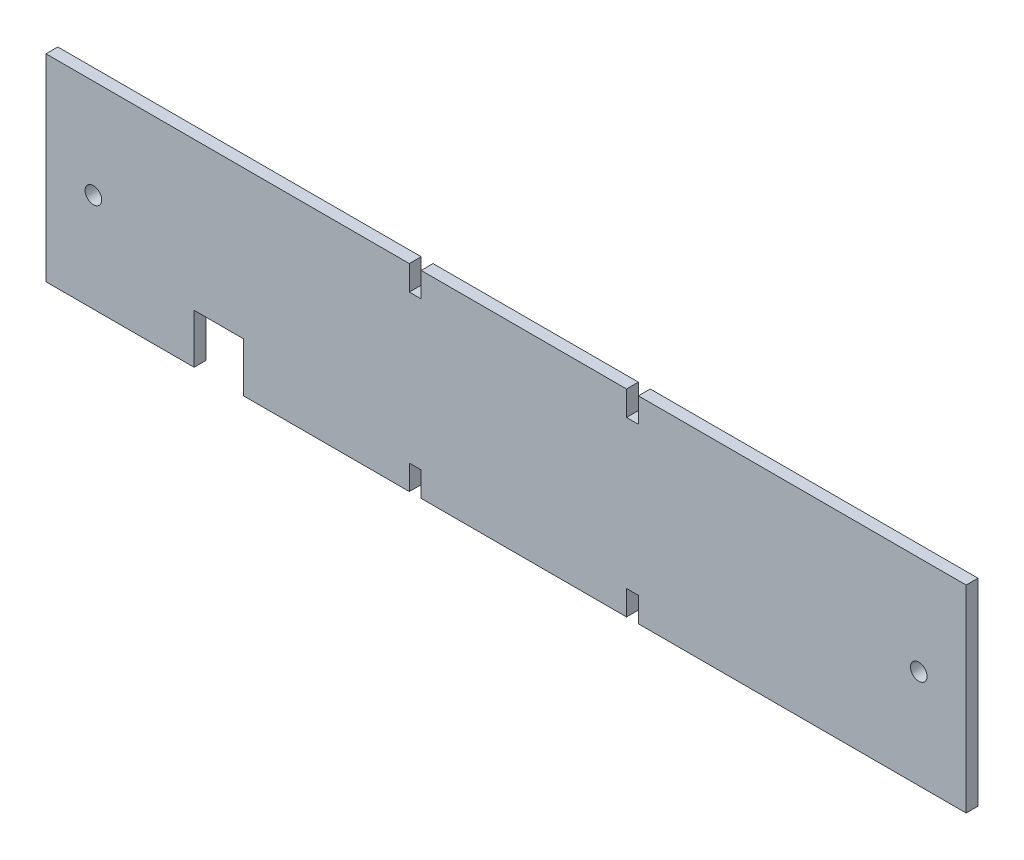
ISO-10303-21;
HEADER;
FILE_DESCRIPTION(('STEP AP214'),'2;1');
FILE_NAME('part.step','',(''),(''),'','','');
FILE_SCHEMA(('AUTOMOTIVE_DESIGN { 1 0 10303 214 1 1 1 1 }'));
ENDSEC;
DATA;
#1=APPLICATION_CONTEXT('core data for automotive mechanical design processes');
#2=APPLICATION_PROTOCOL_DEFINITION('international standard','automotive_design',2000,#1);
#3=PRODUCT_CONTEXT('',#1,'mechanical');
#4=PRODUCT('Part','Part','',(#3));
#5=PRODUCT_RELATED_PRODUCT_CATEGORY('part','',(#4));
#6=PRODUCT_DEFINITION_FORMATION('','',#4);
#7=PRODUCT_DEFINITION_CONTEXT('part definition',#1,'design');
#8=PRODUCT_DEFINITION('design','',#6,#7);
#9=PRODUCT_DEFINITION_SHAPE('','',#8);
#10=(LENGTH_UNIT() NAMED_UNIT(*) SI_UNIT(.MILLI.,.METRE.));
#11=(NAMED_UNIT(*) PLANE_ANGLE_UNIT() SI_UNIT($,.RADIAN.));
#12=(NAMED_UNIT(*) SI_UNIT($,.STERADIAN.) SOLID_ANGLE_UNIT());
#13=UNCERTAINTY_MEASURE_WITH_UNIT(LENGTH_MEASURE(1.E-05),#10,'distance_accuracy_value','');
#14=(GEOMETRIC_REPRESENTATION_CONTEXT(3) GLOBAL_UNCERTAINTY_ASSIGNED_CONTEXT((#13)) GLOBAL_UNIT_ASSIGNED_CONTEXT((#10,
#11,#12)) REPRESENTATION_CONTEXT('',''));
#15=CARTESIAN_POINT('',(0.,0.,0.));
#16=DIRECTION('',(0.,0.,1.));
#17=DIRECTION('',(1.,0.,0.));
#18=AXIS2_PLACEMENT_3D('',#15,#16,#17);
#19=CARTESIAN_POINT('',(0.,0.,6.));
#20=DIRECTION('',(0.,1.,0.));
#21=DIRECTION('',(0.,0.,1.));
#22=AXIS2_PLACEMENT_3D('',#19,#20,#21);
#23=PLANE('',#22);
#24=DIRECTION('',(1.,0.,0.));
#25=VECTOR('',#24,1.);
#26=CARTESIAN_POINT('',(0.,0.,6.));
#27=LINE('',#26,#25);
#28=CARTESIAN_POINT('',(300.,0.,6.));
#29=VERTEX_POINT('',#28);
#30=CARTESIAN_POINT('',(466.,0.,6.));
#31=VERTEX_POINT('',#30);
#32=EDGE_CURVE('E223',#29,#31,#27,.T.);
#33=ORIENTED_EDGE('',*,*,#32,.F.);
#34=DIRECTION('',(0.,0.,-1.));
#35=VECTOR('',#34,1.);
#36=CARTESIAN_POINT('',(300.,0.,6.));
#37=LINE('',#36,#35);
#38=CARTESIAN_POINT('',(300.,0.,0.));
#39=VERTEX_POINT('',#38);
#40=EDGE_CURVE('E290',#29,#39,#37,.T.);
#41=ORIENTED_EDGE('',*,*,#40,.T.);
#42=DIRECTION('',(1.,0.,0.));
#43=VECTOR('',#42,1.);
#44=CARTESIAN_POINT('',(0.,0.,0.));
#45=LINE('',#44,#43);
#46=CARTESIAN_POINT('',(466.,0.,0.));
#47=VERTEX_POINT('',#46);
#48=EDGE_CURVE('E243',#39,#47,#45,.T.);
#49=ORIENTED_EDGE('',*,*,#48,.T.);
#50=DIRECTION('',(0.,0.,-1.));
#51=VECTOR('',#50,1.);
#52=CARTESIAN_POINT('',(466.,0.,6.));
#53=LINE('',#52,#51);
#54=EDGE_CURVE('E41',#31,#47,#53,.T.);
#55=ORIENTED_EDGE('',*,*,#54,.F.);
#56=EDGE_LOOP('',(#33,#41,#49,#55));
#57=FACE_BOUND('',#56,.T.);
#58=ADVANCED_FACE('F33',(#57),#23,.F.);
#59=CARTESIAN_POINT('',(190.,0.,0.));
#60=VERTEX_POINT('',#59);
#61=CARTESIAN_POINT('',(294.,0.,0.));
#62=VERTEX_POINT('',#61);
#63=EDGE_CURVE('E637',#60,#62,#45,.T.);
#64=ORIENTED_EDGE('',*,*,#63,.T.);
#65=DIRECTION('',(0.,0.,-1.));
#66=VECTOR('',#65,1.);
#67=CARTESIAN_POINT('',(294.,0.,6.));
#68=LINE('',#67,#66);
#69=CARTESIAN_POINT('',(294.,0.,6.));
#70=VERTEX_POINT('',#69);
#71=EDGE_CURVE('E56',#70,#62,#68,.T.);
#72=ORIENTED_EDGE('',*,*,#71,.F.);
#73=CARTESIAN_POINT('',(190.,0.,6.));
#74=VERTEX_POINT('',#73);
#75=EDGE_CURVE('E215',#74,#70,#27,.T.);
#76=ORIENTED_EDGE('',*,*,#75,.F.);
#77=DIRECTION('',(0.,0.,-1.));
#78=VECTOR('',#77,1.);
#79=CARTESIAN_POINT('',(190.,0.,6.));
#80=LINE('',#79,#78);
#81=EDGE_CURVE('E195',#74,#60,#80,.T.);
#82=ORIENTED_EDGE('',*,*,#81,.T.);
#83=EDGE_LOOP('',(#64,#72,#76,#82));
#84=FACE_BOUND('',#83,.T.);
#85=ADVANCED_FACE('F221',(#84),#23,.F.);
#86=CARTESIAN_POINT('',(0.,100.,6.));
#87=DIRECTION('',(0.,-1.,0.));
#88=DIRECTION('',(0.,0.,-1.));
#89=AXIS2_PLACEMENT_3D('',#86,#87,#88);
#90=PLANE('',#89);
#91=DIRECTION('',(-1.,0.,0.));
#92=VECTOR('',#91,1.);
#93=CARTESIAN_POINT('',(0.,100.,6.));
#94=LINE('',#93,#92);
#95=CARTESIAN_POINT('',(184.,100.,6.));
#96=VERTEX_POINT('',#95);
#97=CARTESIAN_POINT('',(0.,100.,6.));
#98=VERTEX_POINT('',#97);
#99=EDGE_CURVE('E234',#96,#98,#94,.T.);
#100=ORIENTED_EDGE('',*,*,#99,.F.);
#101=DIRECTION('',(0.,0.,-1.));
#102=VECTOR('',#101,1.);
#103=CARTESIAN_POINT('',(184.,100.,6.));
#104=LINE('',#103,#102);
#105=CARTESIAN_POINT('',(184.,100.,0.));
#106=VERTEX_POINT('',#105);
#107=EDGE_CURVE('E419',#96,#106,#104,.T.);
#108=ORIENTED_EDGE('',*,*,#107,.T.);
#109=DIRECTION('',(-1.,0.,0.));
#110=VECTOR('',#109,1.);
#111=CARTESIAN_POINT('',(0.,100.,0.));
#112=LINE('',#111,#110);
#113=CARTESIAN_POINT('',(0.,100.,0.));
#114=VERTEX_POINT('',#113);
#115=EDGE_CURVE('E251',#106,#114,#112,.T.);
#116=ORIENTED_EDGE('',*,*,#115,.T.);
#117=DIRECTION('',(0.,0.,-1.));
#118=VECTOR('',#117,1.);
#119=CARTESIAN_POINT('',(0.,100.,6.));
#120=LINE('',#119,#118);
#121=EDGE_CURVE('E238',#98,#114,#120,.T.);
#122=ORIENTED_EDGE('',*,*,#121,.F.);
#123=EDGE_LOOP('',(#100,#108,#116,#122));
#124=FACE_BOUND('',#123,.T.);
#125=ADVANCED_FACE('F376',(#124),#90,.F.);
#126=CARTESIAN_POINT('',(466.,100.,0.));
#127=VERTEX_POINT('',#126);
#128=CARTESIAN_POINT('',(300.,100.,0.));
#129=VERTEX_POINT('',#128);
#130=EDGE_CURVE('E252',#127,#129,#112,.T.);
#131=ORIENTED_EDGE('',*,*,#130,.T.);
#132=DIRECTION('',(0.,0.,-1.));
#133=VECTOR('',#132,1.);
#134=CARTESIAN_POINT('',(300.,100.,6.));
#135=LINE('',#134,#133);
#136=CARTESIAN_POINT('',(300.,100.,6.));
#137=VERTEX_POINT('',#136);
#138=EDGE_CURVE('E281',#137,#129,#135,.T.);
#139=ORIENTED_EDGE('',*,*,#138,.F.);
#140=CARTESIAN_POINT('',(466.,100.,6.));
#141=VERTEX_POINT('',#140);
#142=EDGE_CURVE('E235',#141,#137,#94,.T.);
#143=ORIENTED_EDGE('',*,*,#142,.F.);
#144=DIRECTION('',(0.,0.,-1.));
#145=VECTOR('',#144,1.);
#146=CARTESIAN_POINT('',(466.,100.,6.));
#147=LINE('',#146,#145);
#148=EDGE_CURVE('E258',#141,#127,#147,.T.);
#149=ORIENTED_EDGE('',*,*,#148,.T.);
#150=EDGE_LOOP('',(#131,#139,#143,#149));
#151=FACE_BOUND('',#150,.T.);
#152=ADVANCED_FACE('F279',(#151),#90,.F.);
#153=CARTESIAN_POINT('',(0.,0.,0.));
#154=VERTEX_POINT('',#153);
#155=CARTESIAN_POINT('',(75.,0.,0.));
#156=VERTEX_POINT('',#155);
#157=EDGE_CURVE('E245',#154,#156,#45,.T.);
#158=ORIENTED_EDGE('',*,*,#157,.T.);
#159=DIRECTION('',(0.,0.,-1.));
#160=VECTOR('',#159,1.);
#161=CARTESIAN_POINT('',(75.,0.,12.));
#162=LINE('',#161,#160);
#163=CARTESIAN_POINT('',(75.,0.,6.));
#164=VERTEX_POINT('',#163);
#165=EDGE_CURVE('E329',#164,#156,#162,.T.);
#166=ORIENTED_EDGE('',*,*,#165,.F.);
#167=CARTESIAN_POINT('',(0.,0.,6.));
#168=VERTEX_POINT('',#167);
#169=EDGE_CURVE('E226',#168,#164,#27,.T.);
#170=ORIENTED_EDGE('',*,*,#169,.F.);
#171=DIRECTION('',(0.,0.,-1.));
#172=VECTOR('',#171,1.);
#173=CARTESIAN_POINT('',(0.,0.,6.));
#174=LINE('',#173,#172);
#175=EDGE_CURVE('E11',#168,#154,#174,.T.);
#176=ORIENTED_EDGE('',*,*,#175,.T.);
#177=EDGE_LOOP('',(#158,#166,#170,#176));
#178=FACE_BOUND('',#177,.T.);
#179=ADVANCED_FACE('F383',(#178),#23,.F.);
#180=CARTESIAN_POINT('',(0.,0.,6.));
#181=DIRECTION('',(1.,0.,0.));
#182=DIRECTION('',(0.,0.,-1.));
#183=AXIS2_PLACEMENT_3D('',#180,#181,#182);
#184=PLANE('',#183);
#185=DIRECTION('',(0.,-1.,0.));
#186=VECTOR('',#185,1.);
#187=CARTESIAN_POINT('',(0.,0.,0.));
#188=LINE('',#187,#186);
#189=EDGE_CURVE('E240',#114,#154,#188,.T.);
#190=ORIENTED_EDGE('',*,*,#189,.T.);
#191=ORIENTED_EDGE('',*,*,#175,.F.);
#192=DIRECTION('',(0.,-1.,0.));
#193=VECTOR('',#192,1.);
#194=CARTESIAN_POINT('',(0.,0.,6.));
#195=LINE('',#194,#193);
#196=EDGE_CURVE('E227',#98,#168,#195,.T.);
#197=ORIENTED_EDGE('',*,*,#196,.F.);
#198=ORIENTED_EDGE('',*,*,#121,.T.);
#199=EDGE_LOOP('',(#190,#191,#197,#198));
#200=FACE_BOUND('',#199,.T.);
#201=ADVANCED_FACE('F35',(#200),#184,.F.);
#202=CARTESIAN_POINT('',(100.,0.,0.));
#203=VERTEX_POINT('',#202);
#204=CARTESIAN_POINT('',(184.,0.,0.));
#205=VERTEX_POINT('',#204);
#206=EDGE_CURVE('E249',#203,#205,#45,.T.);
#207=ORIENTED_EDGE('',*,*,#206,.T.);
#208=DIRECTION('',(0.,0.,-1.));
#209=VECTOR('',#208,1.);
#210=CARTESIAN_POINT('',(184.,0.,6.));
#211=LINE('',#210,#209);
#212=CARTESIAN_POINT('',(184.,0.,6.));
#213=VERTEX_POINT('',#212);
#214=EDGE_CURVE('E206',#213,#205,#211,.T.);
#215=ORIENTED_EDGE('',*,*,#214,.F.);
#216=CARTESIAN_POINT('',(100.,0.,6.));
#217=VERTEX_POINT('',#216);
#218=EDGE_CURVE('E222',#217,#213,#27,.T.);
#219=ORIENTED_EDGE('',*,*,#218,.F.);
#220=DIRECTION('',(0.,0.,-1.));
#221=VECTOR('',#220,1.);
#222=CARTESIAN_POINT('',(100.,0.,12.));
#223=LINE('',#222,#221);
#224=EDGE_CURVE('E332',#217,#203,#223,.T.);
#225=ORIENTED_EDGE('',*,*,#224,.T.);
#226=EDGE_LOOP('',(#207,#215,#219,#225));
#227=FACE_BOUND('',#226,.T.);
#228=ADVANCED_FACE('F378',(#227),#23,.F.);
#229=CARTESIAN_POINT('',(466.,0.,6.));
#230=DIRECTION('',(-1.,0.,0.));
#231=DIRECTION('',(0.,0.,1.));
#232=AXIS2_PLACEMENT_3D('',#229,#230,#231);
#233=PLANE('',#232);
#234=DIRECTION('',(0.,1.,0.));
#235=VECTOR('',#234,1.);
#236=CARTESIAN_POINT('',(466.,0.,0.));
#237=LINE('',#236,#235);
#238=EDGE_CURVE('E248',#47,#127,#237,.T.);
#239=ORIENTED_EDGE('',*,*,#238,.T.);
#240=ORIENTED_EDGE('',*,*,#148,.F.);
#241=DIRECTION('',(0.,1.,0.));
#242=VECTOR('',#241,1.);
#243=CARTESIAN_POINT('',(466.,0.,6.));
#244=LINE('',#243,#242);
#245=EDGE_CURVE('E231',#31,#141,#244,.T.);
#246=ORIENTED_EDGE('',*,*,#245,.F.);
#247=ORIENTED_EDGE('',*,*,#54,.T.);
#248=EDGE_LOOP('',(#239,#240,#246,#247));
#249=FACE_BOUND('',#248,.T.);
#250=ADVANCED_FACE('F265',(#249),#233,.F.);
#251=CARTESIAN_POINT('',(294.,100.,0.));
#252=VERTEX_POINT('',#251);
#253=CARTESIAN_POINT('',(190.,100.,0.));
#254=VERTEX_POINT('',#253);
#255=EDGE_CURVE('E255',#252,#254,#112,.T.);
#256=ORIENTED_EDGE('',*,*,#255,.T.);
#257=DIRECTION('',(0.,0.,-1.));
#258=VECTOR('',#257,1.);
#259=CARTESIAN_POINT('',(190.,100.,6.));
#260=LINE('',#259,#258);
#261=CARTESIAN_POINT('',(190.,100.,6.));
#262=VERTEX_POINT('',#261);
#263=EDGE_CURVE('E424',#262,#254,#260,.T.);
#264=ORIENTED_EDGE('',*,*,#263,.F.);
#265=CARTESIAN_POINT('',(294.,100.,6.));
#266=VERTEX_POINT('',#265);
#267=EDGE_CURVE('E239',#266,#262,#94,.T.);
#268=ORIENTED_EDGE('',*,*,#267,.F.);
#269=DIRECTION('',(0.,0.,-1.));
#270=VECTOR('',#269,1.);
#271=CARTESIAN_POINT('',(294.,100.,6.));
#272=LINE('',#271,#270);
#273=EDGE_CURVE('E316',#266,#252,#272,.T.);
#274=ORIENTED_EDGE('',*,*,#273,.T.);
#275=EDGE_LOOP('',(#256,#264,#268,#274));
#276=FACE_BOUND('',#275,.T.);
#277=ADVANCED_FACE('F367',(#276),#90,.F.);
#278=CARTESIAN_POINT('',(0.,0.,6.));
#279=DIRECTION('',(0.,0.,-1.));
#280=DIRECTION('',(-1.,0.,0.));
#281=AXIS2_PLACEMENT_3D('',#278,#279,#280);
#282=PLANE('',#281);
#283=DIRECTION('',(-1.,0.,0.));
#284=VECTOR('',#283,1.);
#285=CARTESIAN_POINT('',(184.,87.5,6.));
#286=LINE('',#285,#284);
#287=CARTESIAN_POINT('',(190.,87.5,6.));
#288=VERTEX_POINT('',#287);
#289=CARTESIAN_POINT('',(184.,87.5,6.));
#290=VERTEX_POINT('',#289);
#291=EDGE_CURVE('E447',#288,#290,#286,.T.);
#292=ORIENTED_EDGE('',*,*,#291,.T.);
#293=DIRECTION('',(0.,1.,0.));
#294=VECTOR('',#293,1.);
#295=CARTESIAN_POINT('',(184.,100.,6.));
#296=LINE('',#295,#294);
#297=EDGE_CURVE('E436',#290,#96,#296,.T.);
#298=ORIENTED_EDGE('',*,*,#297,.T.);
#299=ORIENTED_EDGE('',*,*,#99,.T.);
#300=ORIENTED_EDGE('',*,*,#196,.T.);
#301=ORIENTED_EDGE('',*,*,#169,.T.);
#302=DIRECTION('',(0.,1.,0.));
#303=VECTOR('',#302,1.);
#304=CARTESIAN_POINT('',(75.,0.,6.));
#305=LINE('',#304,#303);
#306=CARTESIAN_POINT('',(75.,25.,6.));
#307=VERTEX_POINT('',#306);
#308=EDGE_CURVE('E344',#164,#307,#305,.T.);
#309=ORIENTED_EDGE('',*,*,#308,.T.);
#310=DIRECTION('',(1.,0.,0.));
#311=VECTOR('',#310,1.);
#312=CARTESIAN_POINT('',(0.,25.,6.));
#313=LINE('',#312,#311);
#314=CARTESIAN_POINT('',(100.,25.,6.));
#315=VERTEX_POINT('',#314);
#316=EDGE_CURVE('E331',#307,#315,#313,.T.);
#317=ORIENTED_EDGE('',*,*,#316,.T.);
#318=DIRECTION('',(0.,-1.,0.));
#319=VECTOR('',#318,1.);
#320=CARTESIAN_POINT('',(100.,0.,6.));
#321=LINE('',#320,#319);
#322=EDGE_CURVE('E341',#315,#217,#321,.T.);
#323=ORIENTED_EDGE('',*,*,#322,.T.);
#324=ORIENTED_EDGE('',*,*,#218,.T.);
#325=DIRECTION('',(0.,1.,0.));
#326=VECTOR('',#325,1.);
#327=CARTESIAN_POINT('',(184.,0.,6.));
#328=LINE('',#327,#326);
#329=CARTESIAN_POINT('',(184.,12.5,6.));
#330=VERTEX_POINT('',#329);
#331=EDGE_CURVE('E218',#213,#330,#328,.T.);
#332=ORIENTED_EDGE('',*,*,#331,.T.);
#333=DIRECTION('',(1.,0.,0.));
#334=VECTOR('',#333,1.);
#335=CARTESIAN_POINT('',(190.,12.5,6.));
#336=LINE('',#335,#334);
#337=CARTESIAN_POINT('',(190.,12.5,6.));
#338=VERTEX_POINT('',#337);
#339=EDGE_CURVE('E207',#330,#338,#336,.T.);
#340=ORIENTED_EDGE('',*,*,#339,.T.);
#341=DIRECTION('',(0.,-1.,0.));
#342=VECTOR('',#341,1.);
#343=CARTESIAN_POINT('',(190.,0.,6.));
#344=LINE('',#343,#342);
#345=EDGE_CURVE('E198',#338,#74,#344,.T.);
#346=ORIENTED_EDGE('',*,*,#345,.T.);
#347=ORIENTED_EDGE('',*,*,#75,.T.);
#348=DIRECTION('',(0.,1.,0.));
#349=VECTOR('',#348,1.);
#350=CARTESIAN_POINT('',(294.,0.,6.));
#351=LINE('',#350,#349);
#352=CARTESIAN_POINT('',(294.,12.5,6.));
#353=VERTEX_POINT('',#352);
#354=EDGE_CURVE('E296',#70,#353,#351,.T.);
#355=ORIENTED_EDGE('',*,*,#354,.T.);
#356=DIRECTION('',(1.,0.,0.));
#357=VECTOR('',#356,1.);
#358=CARTESIAN_POINT('',(300.,12.5,6.));
#359=LINE('',#358,#357);
#360=CARTESIAN_POINT('',(300.,12.5,6.));
#361=VERTEX_POINT('',#360);
#362=EDGE_CURVE('E292',#353,#361,#359,.T.);
#363=ORIENTED_EDGE('',*,*,#362,.T.);
#364=DIRECTION('',(0.,-1.,0.));
#365=VECTOR('',#364,1.);
#366=CARTESIAN_POINT('',(300.,0.,6.));
#367=LINE('',#366,#365);
#368=EDGE_CURVE('E288',#361,#29,#367,.T.);
#369=ORIENTED_EDGE('',*,*,#368,.T.);
#370=ORIENTED_EDGE('',*,*,#32,.T.);
#371=ORIENTED_EDGE('',*,*,#245,.T.);
#372=ORIENTED_EDGE('',*,*,#142,.T.);
#373=DIRECTION('',(0.,-1.,0.));
#374=VECTOR('',#373,1.);
#375=CARTESIAN_POINT('',(300.,100.,6.));
#376=LINE('',#375,#374);
#377=CARTESIAN_POINT('',(300.,87.5,6.));
#378=VERTEX_POINT('',#377);
#379=EDGE_CURVE('E284',#137,#378,#376,.T.);
#380=ORIENTED_EDGE('',*,*,#379,.T.);
#381=DIRECTION('',(-1.,0.,0.));
#382=VECTOR('',#381,1.);
#383=CARTESIAN_POINT('',(300.,87.5,6.));
#384=LINE('',#383,#382);
#385=CARTESIAN_POINT('',(294.,87.5,6.));
#386=VERTEX_POINT('',#385);
#387=EDGE_CURVE('E301',#378,#386,#384,.T.);
#388=ORIENTED_EDGE('',*,*,#387,.T.);
#389=DIRECTION('',(0.,1.,0.));
#390=VECTOR('',#389,1.);
#391=CARTESIAN_POINT('',(294.,100.,6.));
#392=LINE('',#391,#390);
#393=EDGE_CURVE('E304',#386,#266,#392,.T.);
#394=ORIENTED_EDGE('',*,*,#393,.T.);
#395=ORIENTED_EDGE('',*,*,#267,.T.);
#396=DIRECTION('',(0.,-1.,0.));
#397=VECTOR('',#396,1.);
#398=CARTESIAN_POINT('',(190.,100.,6.));
#399=LINE('',#398,#397);
#400=EDGE_CURVE('E618',#262,#288,#399,.T.);
#401=ORIENTED_EDGE('',*,*,#400,.T.);
#402=EDGE_LOOP('',(#292,#298,#299,#300,#301,#309,#317,#323,#324,#332,#340,#346,#347,#355,#363,
#369,#370,#371,#372,#380,#388,#394,#395,#401));
#403=FACE_BOUND('',#402,.T.);
#404=CARTESIAN_POINT('',(24.,50.,6.));
#405=DIRECTION('',(0.,0.,1.));
#406=DIRECTION('',(1.,0.,0.));
#407=AXIS2_PLACEMENT_3D('',#404,#405,#406);
#408=CIRCLE('',#407,4.2);
#409=CARTESIAN_POINT('',(28.2,50.,6.));
#410=VERTEX_POINT('',#409);
#411=EDGE_CURVE('E347',#410,#410,#408,.T.);
#412=ORIENTED_EDGE('',*,*,#411,.F.);
#413=EDGE_LOOP('',(#412));
#414=FACE_BOUND('',#413,.T.);
#415=CARTESIAN_POINT('',(442.,50.,6.));
#416=DIRECTION('',(0.,0.,1.));
#417=DIRECTION('',(1.,0.,0.));
#418=AXIS2_PLACEMENT_3D('',#415,#416,#417);
#419=CIRCLE('',#418,4.19999999999998);
#420=CARTESIAN_POINT('',(446.2,50.,6.));
#421=VERTEX_POINT('',#420);
#422=EDGE_CURVE('E353',#421,#421,#419,.T.);
#423=ORIENTED_EDGE('',*,*,#422,.F.);
#424=EDGE_LOOP('',(#423));
#425=FACE_BOUND('',#424,.T.);
#426=ADVANCED_FACE('F212',(#403,#414,#425),#282,.F.);
#427=CARTESIAN_POINT('',(0.,0.,0.));
#428=DIRECTION('',(0.,0.,-1.));
#429=DIRECTION('',(-1.,0.,0.));
#430=AXIS2_PLACEMENT_3D('',#427,#428,#429);
#431=PLANE('',#430);
#432=DIRECTION('',(0.,1.,0.));
#433=VECTOR('',#432,1.);
#434=CARTESIAN_POINT('',(184.,100.,0.));
#435=LINE('',#434,#433);
#436=CARTESIAN_POINT('',(184.,87.5,0.));
#437=VERTEX_POINT('',#436);
#438=EDGE_CURVE('E434',#437,#106,#435,.T.);
#439=ORIENTED_EDGE('',*,*,#438,.F.);
#440=DIRECTION('',(-1.,0.,0.));
#441=VECTOR('',#440,1.);
#442=CARTESIAN_POINT('',(184.,87.5,0.));
#443=LINE('',#442,#441);
#444=CARTESIAN_POINT('',(190.,87.5,0.));
#445=VERTEX_POINT('',#444);
#446=EDGE_CURVE('E432',#445,#437,#443,.T.);
#447=ORIENTED_EDGE('',*,*,#446,.F.);
#448=DIRECTION('',(0.,-1.,0.));
#449=VECTOR('',#448,1.);
#450=CARTESIAN_POINT('',(190.,100.,0.));
#451=LINE('',#450,#449);
#452=EDGE_CURVE('E430',#254,#445,#451,.T.);
#453=ORIENTED_EDGE('',*,*,#452,.F.);
#454=ORIENTED_EDGE('',*,*,#255,.F.);
#455=DIRECTION('',(0.,1.,0.));
#456=VECTOR('',#455,1.);
#457=CARTESIAN_POINT('',(294.,100.,0.));
#458=LINE('',#457,#456);
#459=CARTESIAN_POINT('',(294.,87.5,0.));
#460=VERTEX_POINT('',#459);
#461=EDGE_CURVE('E302',#460,#252,#458,.T.);
#462=ORIENTED_EDGE('',*,*,#461,.F.);
#463=DIRECTION('',(-1.,0.,0.));
#464=VECTOR('',#463,1.);
#465=CARTESIAN_POINT('',(300.,87.5,0.));
#466=LINE('',#465,#464);
#467=CARTESIAN_POINT('',(300.,87.5,0.));
#468=VERTEX_POINT('',#467);
#469=EDGE_CURVE('E309',#468,#460,#466,.T.);
#470=ORIENTED_EDGE('',*,*,#469,.F.);
#471=DIRECTION('',(0.,-1.,0.));
#472=VECTOR('',#471,1.);
#473=CARTESIAN_POINT('',(300.,100.,0.));
#474=LINE('',#473,#472);
#475=EDGE_CURVE('E48',#129,#468,#474,.T.);
#476=ORIENTED_EDGE('',*,*,#475,.F.);
#477=ORIENTED_EDGE('',*,*,#130,.F.);
#478=ORIENTED_EDGE('',*,*,#238,.F.);
#479=ORIENTED_EDGE('',*,*,#48,.F.);
#480=DIRECTION('',(0.,-1.,0.));
#481=VECTOR('',#480,1.);
#482=CARTESIAN_POINT('',(300.,0.,0.));
#483=LINE('',#482,#481);
#484=CARTESIAN_POINT('',(300.,12.5,0.));
#485=VERTEX_POINT('',#484);
#486=EDGE_CURVE('E451',#485,#39,#483,.T.);
#487=ORIENTED_EDGE('',*,*,#486,.F.);
#488=DIRECTION('',(1.,0.,0.));
#489=VECTOR('',#488,1.);
#490=CARTESIAN_POINT('',(300.,12.5,0.));
#491=LINE('',#490,#489);
#492=CARTESIAN_POINT('',(294.,12.5,0.));
#493=VERTEX_POINT('',#492);
#494=EDGE_CURVE('E449',#493,#485,#491,.T.);
#495=ORIENTED_EDGE('',*,*,#494,.F.);
#496=DIRECTION('',(0.,1.,0.));
#497=VECTOR('',#496,1.);
#498=CARTESIAN_POINT('',(294.,0.,0.));
#499=LINE('',#498,#497);
#500=EDGE_CURVE('E453',#62,#493,#499,.T.);
#501=ORIENTED_EDGE('',*,*,#500,.F.);
#502=ORIENTED_EDGE('',*,*,#63,.F.);
#503=DIRECTION('',(0.,-1.,0.));
#504=VECTOR('',#503,1.);
#505=CARTESIAN_POINT('',(190.,0.,0.));
#506=LINE('',#505,#504);
#507=CARTESIAN_POINT('',(190.,12.5,0.));
#508=VERTEX_POINT('',#507);
#509=EDGE_CURVE('E201',#508,#60,#506,.T.);
#510=ORIENTED_EDGE('',*,*,#509,.F.);
#511=DIRECTION('',(1.,0.,0.));
#512=VECTOR('',#511,1.);
#513=CARTESIAN_POINT('',(190.,12.5,0.));
#514=LINE('',#513,#512);
#515=CARTESIAN_POINT('',(184.,12.5,0.));
#516=VERTEX_POINT('',#515);
#517=EDGE_CURVE('E219',#516,#508,#514,.T.);
#518=ORIENTED_EDGE('',*,*,#517,.F.);
#519=DIRECTION('',(0.,1.,0.));
#520=VECTOR('',#519,1.);
#521=CARTESIAN_POINT('',(184.,0.,0.));
#522=LINE('',#521,#520);
#523=EDGE_CURVE('E629',#205,#516,#522,.T.);
#524=ORIENTED_EDGE('',*,*,#523,.F.);
#525=ORIENTED_EDGE('',*,*,#206,.F.);
#526=DIRECTION('',(0.,-1.,0.));
#527=VECTOR('',#526,1.);
#528=CARTESIAN_POINT('',(100.,0.,0.));
#529=LINE('',#528,#527);
#530=CARTESIAN_POINT('',(100.,25.,0.));
#531=VERTEX_POINT('',#530);
#532=EDGE_CURVE('E326',#531,#203,#529,.T.);
#533=ORIENTED_EDGE('',*,*,#532,.F.);
#534=DIRECTION('',(1.,0.,0.));
#535=VECTOR('',#534,1.);
#536=CARTESIAN_POINT('',(75.,25.,0.));
#537=LINE('',#536,#535);
#538=CARTESIAN_POINT('',(75.,25.,0.));
#539=VERTEX_POINT('',#538);
#540=EDGE_CURVE('E323',#539,#531,#537,.T.);
#541=ORIENTED_EDGE('',*,*,#540,.F.);
#542=DIRECTION('',(0.,1.,0.));
#543=VECTOR('',#542,1.);
#544=CARTESIAN_POINT('',(75.,0.,0.));
#545=LINE('',#544,#543);
#546=EDGE_CURVE('E315',#156,#539,#545,.T.);
#547=ORIENTED_EDGE('',*,*,#546,.F.);
#548=ORIENTED_EDGE('',*,*,#157,.F.);
#549=ORIENTED_EDGE('',*,*,#189,.F.);
#550=ORIENTED_EDGE('',*,*,#115,.F.);
#551=EDGE_LOOP('',(#439,#447,#453,#454,#462,#470,#476,#477,#478,#479,#487,#495,#501,#502,#510,
#518,#524,#525,#533,#541,#547,#548,#549,#550));
#552=FACE_BOUND('',#551,.T.);
#553=CARTESIAN_POINT('',(24.,50.,0.));
#554=DIRECTION('',(0.,0.,1.));
#555=DIRECTION('',(1.,0.,0.));
#556=AXIS2_PLACEMENT_3D('',#553,#554,#555);
#557=CIRCLE('',#556,4.2);
#558=CARTESIAN_POINT('',(28.2,50.,0.));
#559=VERTEX_POINT('',#558);
#560=EDGE_CURVE('E350',#559,#559,#557,.T.);
#561=ORIENTED_EDGE('',*,*,#560,.T.);
#562=EDGE_LOOP('',(#561));
#563=FACE_BOUND('',#562,.T.);
#564=CARTESIAN_POINT('',(442.,50.,0.));
#565=DIRECTION('',(0.,0.,1.));
#566=DIRECTION('',(1.,0.,0.));
#567=AXIS2_PLACEMENT_3D('',#564,#565,#566);
#568=CIRCLE('',#567,4.19999999999998);
#569=CARTESIAN_POINT('',(446.2,50.,0.));
#570=VERTEX_POINT('',#569);
#571=EDGE_CURVE('E244',#570,#570,#568,.T.);
#572=ORIENTED_EDGE('',*,*,#571,.T.);
#573=EDGE_LOOP('',(#572));
#574=FACE_BOUND('',#573,.T.);
#575=ADVANCED_FACE('F273',(#552,#563,#574),#431,.T.);
#576=CARTESIAN_POINT('',(442.,50.,6.));
#577=DIRECTION('',(0.,0.,1.));
#578=DIRECTION('',(1.,0.,0.));
#579=AXIS2_PLACEMENT_3D('',#576,#577,#578);
#580=CYLINDRICAL_SURFACE('',#579,4.19999999999998);
#581=ORIENTED_EDGE('',*,*,#571,.F.);
#582=EDGE_LOOP('',(#581));
#583=FACE_BOUND('',#582,.T.);
#584=ORIENTED_EDGE('',*,*,#422,.T.);
#585=EDGE_LOOP('',(#584));
#586=FACE_BOUND('',#585,.T.);
#587=ADVANCED_FACE('F359',(#583,#586),#580,.F.);
#588=CARTESIAN_POINT('',(24.,50.,6.));
#589=DIRECTION('',(0.,0.,1.));
#590=DIRECTION('',(1.,0.,0.));
#591=AXIS2_PLACEMENT_3D('',#588,#589,#590);
#592=CYLINDRICAL_SURFACE('',#591,4.2);
#593=ORIENTED_EDGE('',*,*,#560,.F.);
#594=EDGE_LOOP('',(#593));
#595=FACE_BOUND('',#594,.T.);
#596=ORIENTED_EDGE('',*,*,#411,.T.);
#597=EDGE_LOOP('',(#596));
#598=FACE_BOUND('',#597,.T.);
#599=ADVANCED_FACE('F362',(#595,#598),#592,.F.);
#600=CARTESIAN_POINT('',(75.,0.,12.));
#601=DIRECTION('',(-1.,0.,0.));
#602=DIRECTION('',(0.,0.,1.));
#603=AXIS2_PLACEMENT_3D('',#600,#601,#602);
#604=PLANE('',#603);
#605=ORIENTED_EDGE('',*,*,#165,.T.);
#606=ORIENTED_EDGE('',*,*,#546,.T.);
#607=DIRECTION('',(0.,0.,-1.));
#608=VECTOR('',#607,1.);
#609=CARTESIAN_POINT('',(75.,25.,12.));
#610=LINE('',#609,#608);
#611=EDGE_CURVE('E328',#307,#539,#610,.T.);
#612=ORIENTED_EDGE('',*,*,#611,.F.);
#613=ORIENTED_EDGE('',*,*,#308,.F.);
#614=EDGE_LOOP('',(#605,#606,#612,#613));
#615=FACE_BOUND('',#614,.T.);
#616=ADVANCED_FACE('F407',(#615),#604,.F.);
#617=CARTESIAN_POINT('',(100.,0.,12.));
#618=DIRECTION('',(1.,0.,0.));
#619=DIRECTION('',(0.,0.,-1.));
#620=AXIS2_PLACEMENT_3D('',#617,#618,#619);
#621=PLANE('',#620);
#622=DIRECTION('',(0.,0.,-1.));
#623=VECTOR('',#622,1.);
#624=CARTESIAN_POINT('',(100.,25.,12.));
#625=LINE('',#624,#623);
#626=EDGE_CURVE('E335',#315,#531,#625,.T.);
#627=ORIENTED_EDGE('',*,*,#626,.T.);
#628=ORIENTED_EDGE('',*,*,#532,.T.);
#629=ORIENTED_EDGE('',*,*,#224,.F.);
#630=ORIENTED_EDGE('',*,*,#322,.F.);
#631=EDGE_LOOP('',(#627,#628,#629,#630));
#632=FACE_BOUND('',#631,.T.);
#633=ADVANCED_FACE('F488',(#632),#621,.F.);
#634=CARTESIAN_POINT('',(75.,25.,12.));
#635=DIRECTION('',(0.,1.,0.));
#636=DIRECTION('',(-1.,0.,0.));
#637=AXIS2_PLACEMENT_3D('',#634,#635,#636);
#638=PLANE('',#637);
#639=ORIENTED_EDGE('',*,*,#611,.T.);
#640=ORIENTED_EDGE('',*,*,#540,.T.);
#641=ORIENTED_EDGE('',*,*,#626,.F.);
#642=ORIENTED_EDGE('',*,*,#316,.F.);
#643=EDGE_LOOP('',(#639,#640,#641,#642));
#644=FACE_BOUND('',#643,.T.);
#645=ADVANCED_FACE('F409',(#644),#638,.F.);
#646=CARTESIAN_POINT('',(300.,100.,6.));
#647=DIRECTION('',(1.,0.,0.));
#648=DIRECTION('',(0.,0.,-1.));
#649=AXIS2_PLACEMENT_3D('',#646,#647,#648);
#650=PLANE('',#649);
#651=ORIENTED_EDGE('',*,*,#475,.T.);
#652=DIRECTION('',(0.,0.,-1.));
#653=VECTOR('',#652,1.);
#654=CARTESIAN_POINT('',(300.,87.5,6.));
#655=LINE('',#654,#653);
#656=EDGE_CURVE('E307',#378,#468,#655,.T.);
#657=ORIENTED_EDGE('',*,*,#656,.F.);
#658=ORIENTED_EDGE('',*,*,#379,.F.);
#659=ORIENTED_EDGE('',*,*,#138,.T.);
#660=EDGE_LOOP('',(#651,#657,#658,#659));
#661=FACE_BOUND('',#660,.T.);
#662=ADVANCED_FACE('F481',(#661),#650,.F.);
#663=CARTESIAN_POINT('',(294.,100.,6.));
#664=DIRECTION('',(-1.,0.,0.));
#665=DIRECTION('',(0.,0.,1.));
#666=AXIS2_PLACEMENT_3D('',#663,#664,#665);
#667=PLANE('',#666);
#668=ORIENTED_EDGE('',*,*,#461,.T.);
#669=ORIENTED_EDGE('',*,*,#273,.F.);
#670=ORIENTED_EDGE('',*,*,#393,.F.);
#671=DIRECTION('',(0.,0.,-1.));
#672=VECTOR('',#671,1.);
#673=CARTESIAN_POINT('',(294.,87.5,6.));
#674=LINE('',#673,#672);
#675=EDGE_CURVE('E319',#386,#460,#674,.T.);
#676=ORIENTED_EDGE('',*,*,#675,.T.);
#677=EDGE_LOOP('',(#668,#669,#670,#676));
#678=FACE_BOUND('',#677,.T.);
#679=ADVANCED_FACE('F477',(#678),#667,.F.);
#680=CARTESIAN_POINT('',(300.,87.5,6.));
#681=DIRECTION('',(0.,-1.,0.));
#682=DIRECTION('',(1.,0.,0.));
#683=AXIS2_PLACEMENT_3D('',#680,#681,#682);
#684=PLANE('',#683);
#685=ORIENTED_EDGE('',*,*,#469,.T.);
#686=ORIENTED_EDGE('',*,*,#675,.F.);
#687=ORIENTED_EDGE('',*,*,#387,.F.);
#688=ORIENTED_EDGE('',*,*,#656,.T.);
#689=EDGE_LOOP('',(#685,#686,#687,#688));
#690=FACE_BOUND('',#689,.T.);
#691=ADVANCED_FACE('F480',(#690),#684,.F.);
#692=CARTESIAN_POINT('',(190.,0.,6.));
#693=DIRECTION('',(1.,0.,0.));
#694=DIRECTION('',(0.,0.,-1.));
#695=AXIS2_PLACEMENT_3D('',#692,#693,#694);
#696=PLANE('',#695);
#697=ORIENTED_EDGE('',*,*,#509,.T.);
#698=ORIENTED_EDGE('',*,*,#81,.F.);
#699=ORIENTED_EDGE('',*,*,#345,.F.);
#700=DIRECTION('',(0.,0.,-1.));
#701=VECTOR('',#700,1.);
#702=CARTESIAN_POINT('',(190.,12.5,6.));
#703=LINE('',#702,#701);
#704=EDGE_CURVE('E454',#338,#508,#703,.T.);
#705=ORIENTED_EDGE('',*,*,#704,.T.);
#706=EDGE_LOOP('',(#697,#698,#699,#705));
#707=FACE_BOUND('',#706,.T.);
#708=ADVANCED_FACE('F197',(#707),#696,.F.);
#709=CARTESIAN_POINT('',(190.,12.5,6.));
#710=DIRECTION('',(0.,1.,0.));
#711=DIRECTION('',(-1.,0.,0.));
#712=AXIS2_PLACEMENT_3D('',#709,#710,#711);
#713=PLANE('',#712);
#714=ORIENTED_EDGE('',*,*,#517,.T.);
#715=ORIENTED_EDGE('',*,*,#704,.F.);
#716=ORIENTED_EDGE('',*,*,#339,.F.);
#717=DIRECTION('',(0.,0.,-1.));
#718=VECTOR('',#717,1.);
#719=CARTESIAN_POINT('',(184.,12.5,6.));
#720=LINE('',#719,#718);
#721=EDGE_CURVE('E624',#330,#516,#720,.T.);
#722=ORIENTED_EDGE('',*,*,#721,.T.);
#723=EDGE_LOOP('',(#714,#715,#716,#722));
#724=FACE_BOUND('',#723,.T.);
#725=ADVANCED_FACE('F472',(#724),#713,.F.);
#726=CARTESIAN_POINT('',(184.,0.,6.));
#727=DIRECTION('',(-1.,0.,0.));
#728=DIRECTION('',(0.,0.,1.));
#729=AXIS2_PLACEMENT_3D('',#726,#727,#728);
#730=PLANE('',#729);
#731=ORIENTED_EDGE('',*,*,#523,.T.);
#732=ORIENTED_EDGE('',*,*,#721,.F.);
#733=ORIENTED_EDGE('',*,*,#331,.F.);
#734=ORIENTED_EDGE('',*,*,#214,.T.);
#735=EDGE_LOOP('',(#731,#732,#733,#734));
#736=FACE_BOUND('',#735,.T.);
#737=ADVANCED_FACE('F465',(#736),#730,.F.);
#738=CARTESIAN_POINT('',(300.,0.,6.));
#739=DIRECTION('',(1.,0.,0.));
#740=DIRECTION('',(0.,0.,-1.));
#741=AXIS2_PLACEMENT_3D('',#738,#739,#740);
#742=PLANE('',#741);
#743=ORIENTED_EDGE('',*,*,#486,.T.);
#744=ORIENTED_EDGE('',*,*,#40,.F.);
#745=ORIENTED_EDGE('',*,*,#368,.F.);
#746=DIRECTION('',(0.,0.,-1.));
#747=VECTOR('',#746,1.);
#748=CARTESIAN_POINT('',(300.,12.5,6.));
#749=LINE('',#748,#747);
#750=EDGE_CURVE('E438',#361,#485,#749,.T.);
#751=ORIENTED_EDGE('',*,*,#750,.T.);
#752=EDGE_LOOP('',(#743,#744,#745,#751));
#753=FACE_BOUND('',#752,.T.);
#754=ADVANCED_FACE('F463',(#753),#742,.F.);
#755=CARTESIAN_POINT('',(300.,12.5,6.));
#756=DIRECTION('',(0.,1.,0.));
#757=DIRECTION('',(-1.,0.,0.));
#758=AXIS2_PLACEMENT_3D('',#755,#756,#757);
#759=PLANE('',#758);
#760=ORIENTED_EDGE('',*,*,#494,.T.);
#761=ORIENTED_EDGE('',*,*,#750,.F.);
#762=ORIENTED_EDGE('',*,*,#362,.F.);
#763=DIRECTION('',(0.,0.,-1.));
#764=VECTOR('',#763,1.);
#765=CARTESIAN_POINT('',(294.,12.5,6.));
#766=LINE('',#765,#764);
#767=EDGE_CURVE('E294',#353,#493,#766,.T.);
#768=ORIENTED_EDGE('',*,*,#767,.T.);
#769=EDGE_LOOP('',(#760,#761,#762,#768));
#770=FACE_BOUND('',#769,.T.);
#771=ADVANCED_FACE('F460',(#770),#759,.F.);
#772=CARTESIAN_POINT('',(294.,0.,6.));
#773=DIRECTION('',(-1.,0.,0.));
#774=DIRECTION('',(0.,0.,1.));
#775=AXIS2_PLACEMENT_3D('',#772,#773,#774);
#776=PLANE('',#775);
#777=ORIENTED_EDGE('',*,*,#500,.T.);
#778=ORIENTED_EDGE('',*,*,#767,.F.);
#779=ORIENTED_EDGE('',*,*,#354,.F.);
#780=ORIENTED_EDGE('',*,*,#71,.T.);
#781=EDGE_LOOP('',(#777,#778,#779,#780));
#782=FACE_BOUND('',#781,.T.);
#783=ADVANCED_FACE('F462',(#782),#776,.F.);
#784=CARTESIAN_POINT('',(184.,100.,6.));
#785=DIRECTION('',(-1.,0.,0.));
#786=DIRECTION('',(0.,0.,1.));
#787=AXIS2_PLACEMENT_3D('',#784,#785,#786);
#788=PLANE('',#787);
#789=ORIENTED_EDGE('',*,*,#438,.T.);
#790=ORIENTED_EDGE('',*,*,#107,.F.);
#791=ORIENTED_EDGE('',*,*,#297,.F.);
#792=DIRECTION('',(0.,0.,-1.));
#793=VECTOR('',#792,1.);
#794=CARTESIAN_POINT('',(184.,87.5,6.));
#795=LINE('',#794,#793);
#796=EDGE_CURVE('E310',#290,#437,#795,.T.);
#797=ORIENTED_EDGE('',*,*,#796,.T.);
#798=EDGE_LOOP('',(#789,#790,#791,#797));
#799=FACE_BOUND('',#798,.T.);
#800=ADVANCED_FACE('F585',(#799),#788,.F.);
#801=CARTESIAN_POINT('',(184.,87.5,6.));
#802=DIRECTION('',(0.,-1.,0.));
#803=DIRECTION('',(0.,0.,-1.));
#804=AXIS2_PLACEMENT_3D('',#801,#802,#803);
#805=PLANE('',#804);
#806=ORIENTED_EDGE('',*,*,#446,.T.);
#807=ORIENTED_EDGE('',*,*,#796,.F.);
#808=ORIENTED_EDGE('',*,*,#291,.F.);
#809=DIRECTION('',(0.,0.,-1.));
#810=VECTOR('',#809,1.);
#811=CARTESIAN_POINT('',(190.,87.5,6.));
#812=LINE('',#811,#810);
#813=EDGE_CURVE('E443',#288,#445,#812,.T.);
#814=ORIENTED_EDGE('',*,*,#813,.T.);
#815=EDGE_LOOP('',(#806,#807,#808,#814));
#816=FACE_BOUND('',#815,.T.);
#817=ADVANCED_FACE('F593',(#816),#805,.F.);
#818=CARTESIAN_POINT('',(190.,100.,6.));
#819=DIRECTION('',(1.,0.,0.));
#820=DIRECTION('',(0.,0.,-1.));
#821=AXIS2_PLACEMENT_3D('',#818,#819,#820);
#822=PLANE('',#821);
#823=ORIENTED_EDGE('',*,*,#452,.T.);
#824=ORIENTED_EDGE('',*,*,#813,.F.);
#825=ORIENTED_EDGE('',*,*,#400,.F.);
#826=ORIENTED_EDGE('',*,*,#263,.T.);
#827=EDGE_LOOP('',(#823,#824,#825,#826));
#828=FACE_BOUND('',#827,.T.);
#829=ADVANCED_FACE('F603',(#828),#822,.F.);
#830=CLOSED_SHELL('',(#58,#85,#125,#152,#179,#201,#228,#250,#277,#426,#575,#587,#599,#616,#633,
#645,#662,#679,#691,#708,#725,#737,#754,#771,#783,#800,#817,#829));
#831=MANIFOLD_SOLID_BREP('B2',#830);
#832=ADVANCED_BREP_SHAPE_REPRESENTATION('',(#18,#831),#14);
#833=SHAPE_DEFINITION_REPRESENTATION(#9,#832);
ENDSEC;
END-ISO-10303-21;
